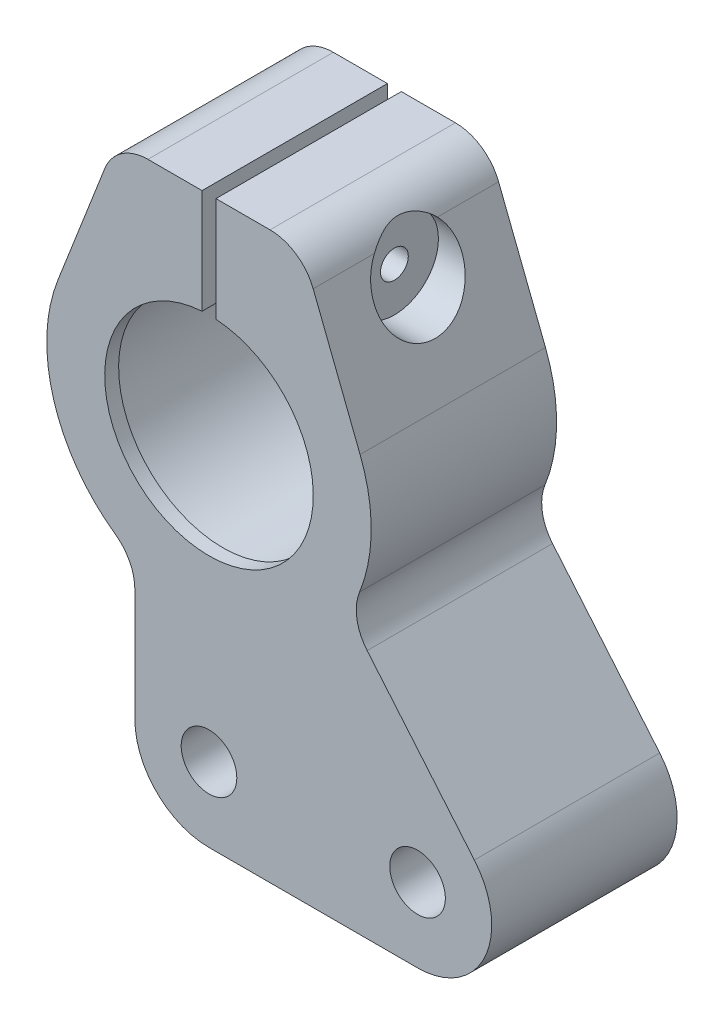
ISO-10303-21;
HEADER;
FILE_DESCRIPTION(('STEP AP214'),'2;1');
FILE_NAME('part.step','',(''),(''),'','','');
FILE_SCHEMA(('AUTOMOTIVE_DESIGN { 1 0 10303 214 1 1 1 1 }'));
ENDSEC;
DATA;
#1=APPLICATION_CONTEXT('core data for automotive mechanical design processes');
#2=APPLICATION_PROTOCOL_DEFINITION('international standard','automotive_design',2000,#1);
#3=PRODUCT_CONTEXT('',#1,'mechanical');
#4=PRODUCT('Part','Part','',(#3));
#5=PRODUCT_RELATED_PRODUCT_CATEGORY('part','',(#4));
#6=PRODUCT_DEFINITION_FORMATION('','',#4);
#7=PRODUCT_DEFINITION_CONTEXT('part definition',#1,'design');
#8=PRODUCT_DEFINITION('design','',#6,#7);
#9=PRODUCT_DEFINITION_SHAPE('','',#8);
#10=(LENGTH_UNIT() NAMED_UNIT(*) SI_UNIT(.MILLI.,.METRE.));
#11=(NAMED_UNIT(*) PLANE_ANGLE_UNIT() SI_UNIT($,.RADIAN.));
#12=(NAMED_UNIT(*) SI_UNIT($,.STERADIAN.) SOLID_ANGLE_UNIT());
#13=UNCERTAINTY_MEASURE_WITH_UNIT(LENGTH_MEASURE(1.E-05),#10,'distance_accuracy_value','');
#14=(GEOMETRIC_REPRESENTATION_CONTEXT(3) GLOBAL_UNCERTAINTY_ASSIGNED_CONTEXT((#13)) GLOBAL_UNIT_ASSIGNED_CONTEXT((#10,
#11,#12)) REPRESENTATION_CONTEXT('',''));
#15=CARTESIAN_POINT('',(0.,0.,0.));
#16=DIRECTION('',(0.,0.,1.));
#17=DIRECTION('',(1.,0.,0.));
#18=AXIS2_PLACEMENT_3D('',#15,#16,#17);
#19=CARTESIAN_POINT('',(0.,0.,40.));
#20=DIRECTION('',(0.,0.,-1.));
#21=DIRECTION('',(-1.,0.,0.));
#22=AXIS2_PLACEMENT_3D('',#19,#20,#21);
#23=CYLINDRICAL_SURFACE('',#22,25.25);
#24=DIRECTION('',(0.,0.,-1.));
#25=VECTOR('',#24,1.);
#26=CARTESIAN_POINT('',(-1.5,25.2054061661383,40.));
#27=LINE('',#26,#25);
#28=CARTESIAN_POINT('',(-1.5,25.2054061661383,37.));
#29=VERTEX_POINT('',#28);
#30=CARTESIAN_POINT('',(-1.5,25.2054061661383,0.));
#31=VERTEX_POINT('',#30);
#32=EDGE_CURVE('E60',#29,#31,#27,.T.);
#33=ORIENTED_EDGE('',*,*,#32,.F.);
#34=CARTESIAN_POINT('',(0.,0.,37.));
#35=DIRECTION('',(0.,0.,1.));
#36=DIRECTION('',(1.,0.,0.));
#37=AXIS2_PLACEMENT_3D('',#34,#35,#36);
#38=CIRCLE('',#37,25.25);
#39=CARTESIAN_POINT('',(1.5,25.2054061661382,37.));
#40=VERTEX_POINT('',#39);
#41=EDGE_CURVE('E55',#40,#29,#38,.F.);
#42=ORIENTED_EDGE('',*,*,#41,.F.);
#43=DIRECTION('',(0.,0.,-1.));
#44=VECTOR('',#43,1.);
#45=CARTESIAN_POINT('',(1.5,25.2054061661382,40.));
#46=LINE('',#45,#44);
#47=CARTESIAN_POINT('',(1.5,25.2054061661382,0.));
#48=VERTEX_POINT('',#47);
#49=EDGE_CURVE('E322',#40,#48,#46,.T.);
#50=ORIENTED_EDGE('',*,*,#49,.T.);
#51=CARTESIAN_POINT('',(0.,0.,0.));
#52=DIRECTION('',(0.,0.,1.));
#53=DIRECTION('',(1.,0.,0.));
#54=AXIS2_PLACEMENT_3D('',#51,#52,#53);
#55=CIRCLE('',#54,25.25);
#56=EDGE_CURVE('E306',#31,#48,#55,.T.);
#57=ORIENTED_EDGE('',*,*,#56,.F.);
#58=EDGE_LOOP('',(#33,#42,#50,#57));
#59=FACE_BOUND('',#58,.T.);
#60=ADVANCED_FACE('F35',(#59),#23,.F.);
#61=CARTESIAN_POINT('',(1.5,0.,40.));
#62=DIRECTION('',(1.,0.,0.));
#63=DIRECTION('',(0.,1.,0.));
#64=AXIS2_PLACEMENT_3D('',#61,#62,#63);
#65=PLANE('',#64);
#66=DIRECTION('',(0.,-1.,0.));
#67=VECTOR('',#66,1.);
#68=CARTESIAN_POINT('',(1.5,0.,0.));
#69=LINE('',#68,#67);
#70=CARTESIAN_POINT('',(1.5,45.,0.));
#71=VERTEX_POINT('',#70);
#72=EDGE_CURVE('E303',#71,#48,#69,.T.);
#73=ORIENTED_EDGE('',*,*,#72,.T.);
#74=ORIENTED_EDGE('',*,*,#49,.F.);
#75=DIRECTION('',(0.,1.,0.));
#76=VECTOR('',#75,1.);
#77=CARTESIAN_POINT('',(1.5,0.,37.));
#78=LINE('',#77,#76);
#79=CARTESIAN_POINT('',(1.5,22.4499443206436,37.));
#80=VERTEX_POINT('',#79);
#81=EDGE_CURVE('E200',#80,#40,#78,.T.);
#82=ORIENTED_EDGE('',*,*,#81,.F.);
#83=DIRECTION('',(0.,0.,1.));
#84=VECTOR('',#83,1.);
#85=CARTESIAN_POINT('',(1.5,22.4499443206436,37.));
#86=LINE('',#85,#84);
#87=CARTESIAN_POINT('',(1.5,22.4499443206436,40.));
#88=VERTEX_POINT('',#87);
#89=EDGE_CURVE('E199',#80,#88,#86,.T.);
#90=ORIENTED_EDGE('',*,*,#89,.T.);
#91=DIRECTION('',(0.,-1.,0.));
#92=VECTOR('',#91,1.);
#93=CARTESIAN_POINT('',(1.5,0.,40.));
#94=LINE('',#93,#92);
#95=CARTESIAN_POINT('',(1.5,45.,40.));
#96=VERTEX_POINT('',#95);
#97=EDGE_CURVE('E267',#96,#88,#94,.T.);
#98=ORIENTED_EDGE('',*,*,#97,.F.);
#99=DIRECTION('',(0.,0.,-1.));
#100=VECTOR('',#99,1.);
#101=CARTESIAN_POINT('',(1.5,45.,40.));
#102=LINE('',#101,#100);
#103=EDGE_CURVE('E324',#96,#71,#102,.T.);
#104=ORIENTED_EDGE('',*,*,#103,.T.);
#105=EDGE_LOOP('',(#73,#74,#82,#90,#98,#104));
#106=FACE_BOUND('',#105,.T.);
#107=CARTESIAN_POINT('',(1.5,32.,20.));
#108=DIRECTION('',(1.,0.,0.));
#109=DIRECTION('',(0.,1.,0.));
#110=AXIS2_PLACEMENT_3D('',#107,#108,#109);
#111=CIRCLE('',#110,3.);
#112=CARTESIAN_POINT('',(1.5,35.,20.));
#113=VERTEX_POINT('',#112);
#114=EDGE_CURVE('E221',#113,#113,#111,.F.);
#115=ORIENTED_EDGE('',*,*,#114,.F.);
#116=EDGE_LOOP('',(#115));
#117=FACE_BOUND('',#116,.T.);
#118=ADVANCED_FACE('F422',(#106,#117),#65,.F.);
#119=CARTESIAN_POINT('',(20.,32.,20.));
#120=DIRECTION('',(-1.,0.,0.));
#121=DIRECTION('',(0.,0.,-1.));
#122=AXIS2_PLACEMENT_3D('',#119,#120,#121);
#123=PLANE('',#122);
#124=CARTESIAN_POINT('',(20.,32.,20.));
#125=DIRECTION('',(1.,0.,0.));
#126=DIRECTION('',(0.,0.,-1.));
#127=AXIS2_PLACEMENT_3D('',#124,#125,#126);
#128=CIRCLE('',#127,9.5);
#129=CARTESIAN_POINT('',(20.,32.,10.5));
#130=VERTEX_POINT('',#129);
#131=EDGE_CURVE('E224',#130,#130,#128,.T.);
#132=ORIENTED_EDGE('',*,*,#131,.T.);
#133=EDGE_LOOP('',(#132));
#134=FACE_BOUND('',#133,.T.);
#135=CARTESIAN_POINT('',(20.,32.,20.));
#136=DIRECTION('',(-1.,0.,0.));
#137=DIRECTION('',(0.,0.,1.));
#138=AXIS2_PLACEMENT_3D('',#135,#136,#137);
#139=CIRCLE('',#138,3.);
#140=CARTESIAN_POINT('',(20.,32.,23.));
#141=VERTEX_POINT('',#140);
#142=EDGE_CURVE('E217',#141,#141,#139,.T.);
#143=ORIENTED_EDGE('',*,*,#142,.T.);
#144=EDGE_LOOP('',(#143));
#145=FACE_BOUND('',#144,.T.);
#146=ADVANCED_FACE('F425',(#134,#145),#123,.F.);
#147=CARTESIAN_POINT('',(32.6018970880081,12.7324901831075,40.));
#148=DIRECTION('',(-0.931482773943089,-0.363785433803071,0.));
#149=DIRECTION('',(0.363785433803071,-0.931482773943089,0.));
#150=AXIS2_PLACEMENT_3D('',#147,#148,#149);
#151=PLANE('',#150);
#152=CARTESIAN_POINT('',(25.077077936096,32.,20.));
#153=DIRECTION('',(-0.931482773943089,-0.363785433803071,0.));
#154=DIRECTION('',(-0.363785433803071,0.931482773943089,0.));
#155=AXIS2_PLACEMENT_3D('',#152,#153,#154);
#156=ELLIPSE('',#155,10.1987930058924,9.5);
#157=CARTESIAN_POINT('',(22.4847007205087,38.6378543380307,26.7962408570538));
#158=VERTEX_POINT('',#157);
#159=CARTESIAN_POINT('',(22.4847007205087,38.6378543380307,13.2037591429462));
#160=VERTEX_POINT('',#159);
#161=EDGE_CURVE('E227',#158,#160,#156,.F.);
#162=ORIENTED_EDGE('',*,*,#161,.F.);
#163=DIRECTION('',(0.,0.,-1.));
#164=VECTOR('',#163,1.);
#165=CARTESIAN_POINT('',(22.4847007205087,38.6378543380307,40.));
#166=LINE('',#165,#164);
#167=CARTESIAN_POINT('',(22.4847007205087,38.6378543380307,40.));
#168=VERTEX_POINT('',#167);
#169=EDGE_CURVE('E369',#158,#168,#166,.F.);
#170=ORIENTED_EDGE('',*,*,#169,.T.);
#171=DIRECTION('',(-0.363785433803071,0.931482773943089,0.));
#172=VECTOR('',#171,1.);
#173=CARTESIAN_POINT('',(32.6018970880081,12.7324901831075,40.));
#174=LINE('',#173,#172);
#175=CARTESIAN_POINT('',(32.6018970880081,12.7324901831075,40.));
#176=VERTEX_POINT('',#175);
#177=EDGE_CURVE('E261',#176,#168,#174,.T.);
#178=ORIENTED_EDGE('',*,*,#177,.F.);
#179=DIRECTION('',(0.,0.,-1.));
#180=VECTOR('',#179,1.);
#181=CARTESIAN_POINT('',(32.6018970880081,12.7324901831075,40.));
#182=LINE('',#181,#180);
#183=CARTESIAN_POINT('',(32.6018970880081,12.7324901831075,0.));
#184=VERTEX_POINT('',#183);
#185=EDGE_CURVE('E326',#176,#184,#182,.T.);
#186=ORIENTED_EDGE('',*,*,#185,.T.);
#187=DIRECTION('',(-0.363785433803071,0.931482773943089,0.));
#188=VECTOR('',#187,1.);
#189=CARTESIAN_POINT('',(32.6018970880081,12.7324901831075,0.));
#190=LINE('',#189,#188);
#191=CARTESIAN_POINT('',(22.4847007205087,38.6378543380307,0.));
#192=VERTEX_POINT('',#191);
#193=EDGE_CURVE('E297',#184,#192,#190,.T.);
#194=ORIENTED_EDGE('',*,*,#193,.T.);
#195=EDGE_CURVE('E370',#192,#160,#166,.F.);
#196=ORIENTED_EDGE('',*,*,#195,.T.);
#197=EDGE_LOOP('',(#162,#170,#178,#186,#194,#196));
#198=FACE_BOUND('',#197,.T.);
#199=ADVANCED_FACE('F431',(#198),#151,.F.);
#200=CARTESIAN_POINT('',(13.1698729810778,35.,40.));
#201=DIRECTION('',(0.,0.,1.));
#202=DIRECTION('',(1.,0.,0.));
#203=AXIS2_PLACEMENT_3D('',#200,#201,#202);
#204=CYLINDRICAL_SURFACE('',#203,10.);
#205=ORIENTED_EDGE('',*,*,#169,.F.);
#206=CARTESIAN_POINT('',(22.4847007205087,38.6378543380307,26.7962408570538));
#207=CARTESIAN_POINT('',(22.4089220284125,38.8319306718288,26.6066509987079));
#208=CARTESIAN_POINT('',(22.3295789757787,39.0171522592439,26.4095359377923));
#209=CARTESIAN_POINT('',(22.1668666860414,39.3693998350474,26.0012303084149));
#210=CARTESIAN_POINT('',(22.0834977777172,39.5364273056786,25.7900408888292));
#211=CARTESIAN_POINT('',(21.9147039907828,39.8539371562067,25.3516238882671));
#212=CARTESIAN_POINT('',(21.8292665226318,40.0041689594917,25.1242198704116));
#213=CARTESIAN_POINT('',(21.6608318800082,40.2849228958467,24.6566536351938));
#214=CARTESIAN_POINT('',(21.5778348787709,40.4154436324424,24.4164905155125));
#215=CARTESIAN_POINT('',(21.4177143447255,40.6563321018755,23.9234419670444));
#216=CARTESIAN_POINT('',(21.3406078796511,40.7666424775017,23.6705228501503));
#217=CARTESIAN_POINT('',(21.1964847722734,40.9656190359119,23.1534717000046));
#218=CARTESIAN_POINT('',(21.1294680873076,41.054285310214,22.88933971417));
#219=CARTESIAN_POINT('',(21.0100142275261,41.2081912444187,22.3529835892029));
#220=CARTESIAN_POINT('',(20.9574861216399,41.2735777994492,22.0808223659592));
#221=CARTESIAN_POINT('',(20.870260200746,41.380348263289,21.5290311638206));
#222=CARTESIAN_POINT('',(20.8355559936271,41.421740777668,21.2494039003407));
#223=CARTESIAN_POINT('',(20.7903472154125,41.4752911814527,20.7264096887685));
#224=CARTESIAN_POINT('',(20.7770767409778,41.4908014950537,20.4836220452338));
#225=CARTESIAN_POINT('',(20.7665566099697,41.5031127859657,19.9972316633137));
#226=CARTESIAN_POINT('',(20.7693053589349,41.4999156253111,19.753629008462));
#227=CARTESIAN_POINT('',(20.7906557371945,41.4748695854423,19.2678382810917));
#228=CARTESIAN_POINT('',(20.8092739494492,41.4530011954931,19.0256519552239));
#229=CARTESIAN_POINT('',(20.8611421876952,41.3910850721146,18.5452715242599));
#230=CARTESIAN_POINT('',(20.8943925360294,41.3510369381886,18.3070775072335));
#231=CARTESIAN_POINT('',(21.0013015682798,41.219345519334,17.6718561082701));
#232=CARTESIAN_POINT('',(21.0869598180243,41.1112045705784,17.2801776470196));
#233=CARTESIAN_POINT('',(21.2829365452269,40.8484892993799,16.5190645449007));
#234=CARTESIAN_POINT('',(21.3932876330211,40.6938534802985,16.1496601466098));
#235=CARTESIAN_POINT('',(21.5886805855716,40.3985332951614,15.551734099901));
#236=CARTESIAN_POINT('',(21.6703813512374,40.2694815157653,15.3162536327478));
#237=CARTESIAN_POINT('',(21.8360704738759,39.9923024347319,14.8575373957987));
#238=CARTESIAN_POINT('',(21.9200593555876,39.8441707279143,14.634304470745));
#239=CARTESIAN_POINT('',(22.0867430174897,39.530002211873,14.2016995056078));
#240=CARTESIAN_POINT('',(22.1694414680154,39.3640345883323,13.9922786530497));
#241=CARTESIAN_POINT('',(22.3308285234003,39.0142329506797,13.5873581225494));
#242=CARTESIAN_POINT('',(22.4095178646233,38.8304022356942,13.391855885497));
#243=CARTESIAN_POINT('',(22.4847007205087,38.6378543380307,13.2037591429462));
#244=B_SPLINE_CURVE_WITH_KNOTS('',3,(#206,#207,#208,#209,#210,#211,#212,#213,#214,#215,#216,
#217,#218,#219,#220,#221,#222,#223,#224,#225,#226,#227,#228,#229,#230,#231,#232,#233,#234,#235,
#236,#237,#238,#239,#240,#241,#242,#243),.UNSPECIFIED.,.F.,.F.,(4,2,2,2,2,2,2,2,2,2,2,2,2,2,2,2,
2,2,4),(0.,0.844717294944796,1.68936572070047,2.54528745223134,3.40126979501468,
4.25964501565844,5.1180166067589,5.97087164563447,6.82342061468885,7.55315558016657,
8.2828179132575,9.01324365063628,9.74368547994665,10.9846709485961,12.2273050869061,
13.0684830211303,13.9098555161052,14.748074702782,15.5861393723115),.UNSPECIFIED.);
#245=EDGE_CURVE('E11',#158,#160,#244,.T.);
#246=ORIENTED_EDGE('',*,*,#245,.T.);
#247=ORIENTED_EDGE('',*,*,#195,.F.);
#248=CARTESIAN_POINT('',(13.1698729810778,35.,0.));
#249=DIRECTION('',(0.,0.,1.));
#250=DIRECTION('',(1.,0.,0.));
#251=AXIS2_PLACEMENT_3D('',#248,#249,#250);
#252=CIRCLE('',#251,10.);
#253=CARTESIAN_POINT('',(13.1698729810778,45.,0.));
#254=VERTEX_POINT('',#253);
#255=EDGE_CURVE('E356',#254,#192,#252,.F.);
#256=ORIENTED_EDGE('',*,*,#255,.F.);
#257=DIRECTION('',(0.,0.,-1.));
#258=VECTOR('',#257,1.);
#259=CARTESIAN_POINT('',(13.1698729810778,45.,0.));
#260=LINE('',#259,#258);
#261=CARTESIAN_POINT('',(13.1698729810778,45.,40.));
#262=VERTEX_POINT('',#261);
#263=EDGE_CURVE('E366',#262,#254,#260,.T.);
#264=ORIENTED_EDGE('',*,*,#263,.F.);
#265=CARTESIAN_POINT('',(13.1698729810778,35.,40.));
#266=DIRECTION('',(0.,0.,1.));
#267=DIRECTION('',(1.,0.,0.));
#268=AXIS2_PLACEMENT_3D('',#265,#266,#267);
#269=CIRCLE('',#268,10.);
#270=EDGE_CURVE('E362',#168,#262,#269,.T.);
#271=ORIENTED_EDGE('',*,*,#270,.F.);
#272=EDGE_LOOP('',(#205,#246,#247,#256,#264,#271));
#273=FACE_BOUND('',#272,.T.);
#274=ADVANCED_FACE('F37',(#273),#204,.T.);
#275=CARTESIAN_POINT('',(-32.6018970880081,12.7324901831075,40.));
#276=DIRECTION('',(-0.931482773943089,0.363785433803071,0.));
#277=DIRECTION('',(-0.363785433803071,-0.931482773943089,0.));
#278=AXIS2_PLACEMENT_3D('',#275,#276,#277);
#279=PLANE('',#278);
#280=CARTESIAN_POINT('',(-25.077077936096,32.,20.));
#281=DIRECTION('',(-0.931482773943089,0.363785433803071,0.));
#282=DIRECTION('',(0.363785433803071,0.931482773943089,0.));
#283=AXIS2_PLACEMENT_3D('',#280,#281,#282);
#284=ELLIPSE('',#283,10.1987930058924,9.5);
#285=CARTESIAN_POINT('',(-22.4847007205087,38.6378543380307,13.2037591429462));
#286=VERTEX_POINT('',#285);
#287=CARTESIAN_POINT('',(-22.4847007205087,38.6378543380307,26.7962408570538));
#288=VERTEX_POINT('',#287);
#289=EDGE_CURVE('E238',#286,#288,#284,.T.);
#290=ORIENTED_EDGE('',*,*,#289,.F.);
#291=DIRECTION('',(0.,0.,-1.));
#292=VECTOR('',#291,1.);
#293=CARTESIAN_POINT('',(-22.4847007205087,38.6378543380307,40.));
#294=LINE('',#293,#292);
#295=CARTESIAN_POINT('',(-22.4847007205087,38.6378543380307,0.));
#296=VERTEX_POINT('',#295);
#297=EDGE_CURVE('E352',#286,#296,#294,.T.);
#298=ORIENTED_EDGE('',*,*,#297,.T.);
#299=DIRECTION('',(0.363785433803071,0.931482773943089,0.));
#300=VECTOR('',#299,1.);
#301=CARTESIAN_POINT('',(-32.6018970880081,12.7324901831075,0.));
#302=LINE('',#301,#300);
#303=CARTESIAN_POINT('',(-32.6018970880081,12.7324901831075,0.));
#304=VERTEX_POINT('',#303);
#305=EDGE_CURVE('E240',#304,#296,#302,.T.);
#306=ORIENTED_EDGE('',*,*,#305,.F.);
#307=DIRECTION('',(0.,0.,-1.));
#308=VECTOR('',#307,1.);
#309=CARTESIAN_POINT('',(-32.6018970880081,12.7324901831075,40.));
#310=LINE('',#309,#308);
#311=CARTESIAN_POINT('',(-32.6018970880081,12.7324901831075,40.));
#312=VERTEX_POINT('',#311);
#313=EDGE_CURVE('E340',#312,#304,#310,.T.);
#314=ORIENTED_EDGE('',*,*,#313,.F.);
#315=DIRECTION('',(0.363785433803071,0.931482773943089,0.));
#316=VECTOR('',#315,1.);
#317=CARTESIAN_POINT('',(-32.6018970880081,12.7324901831075,40.));
#318=LINE('',#317,#316);
#319=CARTESIAN_POINT('',(-22.4847007205087,38.6378543380307,40.));
#320=VERTEX_POINT('',#319);
#321=EDGE_CURVE('E241',#312,#320,#318,.T.);
#322=ORIENTED_EDGE('',*,*,#321,.T.);
#323=EDGE_CURVE('E353',#320,#288,#294,.T.);
#324=ORIENTED_EDGE('',*,*,#323,.T.);
#325=EDGE_LOOP('',(#290,#298,#306,#314,#322,#324));
#326=FACE_BOUND('',#325,.T.);
#327=ADVANCED_FACE('F459',(#326),#279,.T.);
#328=CARTESIAN_POINT('',(0.,0.,40.));
#329=DIRECTION('',(0.,0.,-1.));
#330=DIRECTION('',(-1.,0.,0.));
#331=AXIS2_PLACEMENT_3D('',#328,#329,#330);
#332=CYLINDRICAL_SURFACE('',#331,35.);
#333=CARTESIAN_POINT('',(0.,0.,0.));
#334=DIRECTION('',(0.,0.,1.));
#335=DIRECTION('',(1.,0.,0.));
#336=AXIS2_PLACEMENT_3D('',#333,#334,#335);
#337=CIRCLE('',#336,35.);
#338=CARTESIAN_POINT('',(-20.2222222222222,-28.5667941567664,0.));
#339=VERTEX_POINT('',#338);
#340=EDGE_CURVE('E281',#304,#339,#337,.T.);
#341=ORIENTED_EDGE('',*,*,#340,.T.);
#342=DIRECTION('',(0.,0.,-1.));
#343=VECTOR('',#342,1.);
#344=CARTESIAN_POINT('',(-20.2222222222222,-28.5667941567664,40.));
#345=LINE('',#344,#343);
#346=CARTESIAN_POINT('',(-20.2222222222222,-28.5667941567664,40.));
#347=VERTEX_POINT('',#346);
#348=EDGE_CURVE('E345',#339,#347,#345,.F.);
#349=ORIENTED_EDGE('',*,*,#348,.T.);
#350=CARTESIAN_POINT('',(0.,0.,40.));
#351=DIRECTION('',(0.,0.,1.));
#352=DIRECTION('',(1.,0.,0.));
#353=AXIS2_PLACEMENT_3D('',#350,#351,#352);
#354=CIRCLE('',#353,35.);
#355=EDGE_CURVE('E244',#312,#347,#354,.T.);
#356=ORIENTED_EDGE('',*,*,#355,.F.);
#357=ORIENTED_EDGE('',*,*,#313,.T.);
#358=EDGE_LOOP('',(#341,#349,#356,#357));
#359=FACE_BOUND('',#358,.T.);
#360=ADVANCED_FACE('F439',(#359),#332,.T.);
#361=CARTESIAN_POINT('',(-16.,0.,40.));
#362=DIRECTION('',(-1.,0.,0.));
#363=DIRECTION('',(0.,0.,1.));
#364=AXIS2_PLACEMENT_3D('',#361,#362,#363);
#365=PLANE('',#364);
#366=DIRECTION('',(0.,1.,0.));
#367=VECTOR('',#366,1.);
#368=CARTESIAN_POINT('',(-16.,0.,40.));
#369=LINE('',#368,#367);
#370=CARTESIAN_POINT('',(-16.,-61.,40.));
#371=VERTEX_POINT('',#370);
#372=CARTESIAN_POINT('',(-16.,-36.7287353444139,40.));
#373=VERTEX_POINT('',#372);
#374=EDGE_CURVE('E248',#371,#373,#369,.T.);
#375=ORIENTED_EDGE('',*,*,#374,.T.);
#376=DIRECTION('',(0.,0.,-1.));
#377=VECTOR('',#376,1.);
#378=CARTESIAN_POINT('',(-16.,-36.7287353444139,40.));
#379=LINE('',#378,#377);
#380=CARTESIAN_POINT('',(-16.,-36.7287353444139,0.));
#381=VERTEX_POINT('',#380);
#382=EDGE_CURVE('E342',#373,#381,#379,.T.);
#383=ORIENTED_EDGE('',*,*,#382,.T.);
#384=DIRECTION('',(0.,1.,0.));
#385=VECTOR('',#384,1.);
#386=CARTESIAN_POINT('',(-16.,0.,0.));
#387=LINE('',#386,#385);
#388=CARTESIAN_POINT('',(-16.,-61.,0.));
#389=VERTEX_POINT('',#388);
#390=EDGE_CURVE('E284',#389,#381,#387,.T.);
#391=ORIENTED_EDGE('',*,*,#390,.F.);
#392=DIRECTION('',(0.,0.,-1.));
#393=VECTOR('',#392,1.);
#394=CARTESIAN_POINT('',(-16.,-61.,40.));
#395=LINE('',#394,#393);
#396=EDGE_CURVE('E338',#371,#389,#395,.T.);
#397=ORIENTED_EDGE('',*,*,#396,.F.);
#398=EDGE_LOOP('',(#375,#383,#391,#397));
#399=FACE_BOUND('',#398,.T.);
#400=ADVANCED_FACE('F454',(#399),#365,.T.);
#401=CARTESIAN_POINT('',(0.,-61.,40.));
#402=DIRECTION('',(0.,0.,-1.));
#403=DIRECTION('',(-1.,0.,0.));
#404=AXIS2_PLACEMENT_3D('',#401,#402,#403);
#405=CYLINDRICAL_SURFACE('',#404,16.);
#406=CARTESIAN_POINT('',(0.,-61.,0.));
#407=DIRECTION('',(0.,0.,1.));
#408=DIRECTION('',(1.,0.,0.));
#409=AXIS2_PLACEMENT_3D('',#406,#407,#408);
#410=CIRCLE('',#409,16.);
#411=CARTESIAN_POINT('',(0.,-77.,0.));
#412=VERTEX_POINT('',#411);
#413=EDGE_CURVE('E288',#389,#412,#410,.T.);
#414=ORIENTED_EDGE('',*,*,#413,.T.);
#415=DIRECTION('',(0.,0.,-1.));
#416=VECTOR('',#415,1.);
#417=CARTESIAN_POINT('',(0.,-77.,40.));
#418=LINE('',#417,#416);
#419=CARTESIAN_POINT('',(0.,-77.,40.));
#420=VERTEX_POINT('',#419);
#421=EDGE_CURVE('E335',#420,#412,#418,.T.);
#422=ORIENTED_EDGE('',*,*,#421,.F.);
#423=CARTESIAN_POINT('',(0.,-61.,40.));
#424=DIRECTION('',(0.,0.,1.));
#425=DIRECTION('',(1.,0.,0.));
#426=AXIS2_PLACEMENT_3D('',#423,#424,#425);
#427=CIRCLE('',#426,16.);
#428=EDGE_CURVE('E252',#371,#420,#427,.T.);
#429=ORIENTED_EDGE('',*,*,#428,.F.);
#430=ORIENTED_EDGE('',*,*,#396,.T.);
#431=EDGE_LOOP('',(#414,#422,#429,#430));
#432=FACE_BOUND('',#431,.T.);
#433=ADVANCED_FACE('F450',(#432),#405,.T.);
#434=CARTESIAN_POINT('',(0.,-77.,40.));
#435=DIRECTION('',(0.,1.,0.));
#436=DIRECTION('',(-1.,0.,0.));
#437=AXIS2_PLACEMENT_3D('',#434,#435,#436);
#438=PLANE('',#437);
#439=DIRECTION('',(1.,0.,0.));
#440=VECTOR('',#439,1.);
#441=CARTESIAN_POINT('',(0.,-77.,0.));
#442=LINE('',#441,#440);
#443=CARTESIAN_POINT('',(45.,-77.,0.));
#444=VERTEX_POINT('',#443);
#445=EDGE_CURVE('E290',#412,#444,#442,.T.);
#446=ORIENTED_EDGE('',*,*,#445,.T.);
#447=DIRECTION('',(0.,0.,-1.));
#448=VECTOR('',#447,1.);
#449=CARTESIAN_POINT('',(45.,-77.,40.));
#450=LINE('',#449,#448);
#451=CARTESIAN_POINT('',(45.,-77.,40.));
#452=VERTEX_POINT('',#451);
#453=EDGE_CURVE('E332',#452,#444,#450,.T.);
#454=ORIENTED_EDGE('',*,*,#453,.F.);
#455=DIRECTION('',(1.,0.,0.));
#456=VECTOR('',#455,1.);
#457=CARTESIAN_POINT('',(0.,-77.,40.));
#458=LINE('',#457,#456);
#459=EDGE_CURVE('E254',#420,#452,#458,.T.);
#460=ORIENTED_EDGE('',*,*,#459,.F.);
#461=ORIENTED_EDGE('',*,*,#421,.T.);
#462=EDGE_LOOP('',(#446,#454,#460,#461));
#463=FACE_BOUND('',#462,.T.);
#464=ADVANCED_FACE('F446',(#463),#438,.F.);
#465=CARTESIAN_POINT('',(45.,-61.,40.));
#466=DIRECTION('',(0.,0.,-1.));
#467=DIRECTION('',(-1.,0.,0.));
#468=AXIS2_PLACEMENT_3D('',#465,#466,#467);
#469=CYLINDRICAL_SURFACE('',#468,16.);
#470=CARTESIAN_POINT('',(45.,-61.,0.));
#471=DIRECTION('',(0.,0.,1.));
#472=DIRECTION('',(1.,0.,0.));
#473=AXIS2_PLACEMENT_3D('',#470,#471,#472);
#474=CIRCLE('',#473,16.);
#475=CARTESIAN_POINT('',(57.2567110899036,-50.7153982450153,0.));
#476=VERTEX_POINT('',#475);
#477=EDGE_CURVE('E292',#444,#476,#474,.T.);
#478=ORIENTED_EDGE('',*,*,#477,.T.);
#479=DIRECTION('',(0.,0.,-1.));
#480=VECTOR('',#479,1.);
#481=CARTESIAN_POINT('',(57.2567110899036,-50.7153982450153,40.));
#482=LINE('',#481,#480);
#483=CARTESIAN_POINT('',(57.2567110899036,-50.7153982450153,40.));
#484=VERTEX_POINT('',#483);
#485=EDGE_CURVE('E329',#484,#476,#482,.T.);
#486=ORIENTED_EDGE('',*,*,#485,.F.);
#487=CARTESIAN_POINT('',(45.,-61.,40.));
#488=DIRECTION('',(0.,0.,1.));
#489=DIRECTION('',(1.,0.,0.));
#490=AXIS2_PLACEMENT_3D('',#487,#488,#489);
#491=CIRCLE('',#490,16.);
#492=EDGE_CURVE('E256',#452,#484,#491,.T.);
#493=ORIENTED_EDGE('',*,*,#492,.F.);
#494=ORIENTED_EDGE('',*,*,#453,.T.);
#495=EDGE_LOOP('',(#478,#486,#493,#494));
#496=FACE_BOUND('',#495,.T.);
#497=ADVANCED_FACE('F442',(#496),#469,.T.);
#498=CARTESIAN_POINT('',(8.62715862053689,7.23904561660047,40.));
#499=DIRECTION('',(-0.766044443118975,-0.642787609686544,0.));
#500=DIRECTION('',(0.642787609686544,-0.766044443118975,0.));
#501=AXIS2_PLACEMENT_3D('',#498,#499,#500);
#502=PLANE('',#501);
#503=DIRECTION('',(-0.642787609686544,0.766044443118975,0.));
#504=VECTOR('',#503,1.);
#505=CARTESIAN_POINT('',(8.62715862053689,7.23904561660047,0.));
#506=LINE('',#505,#504);
#507=CARTESIAN_POINT('',(34.1202257367204,-23.1424087053562,0.));
#508=VERTEX_POINT('',#507);
#509=EDGE_CURVE('E294',#476,#508,#506,.T.);
#510=ORIENTED_EDGE('',*,*,#509,.T.);
#511=DIRECTION('',(0.,0.,1.));
#512=VECTOR('',#511,1.);
#513=CARTESIAN_POINT('',(34.1202257367204,-23.1424087053562,40.));
#514=LINE('',#513,#512);
#515=CARTESIAN_POINT('',(34.1202257367204,-23.1424087053562,40.));
#516=VERTEX_POINT('',#515);
#517=EDGE_CURVE('E350',#508,#516,#514,.T.);
#518=ORIENTED_EDGE('',*,*,#517,.T.);
#519=DIRECTION('',(-0.642787609686544,0.766044443118975,0.));
#520=VECTOR('',#519,1.);
#521=CARTESIAN_POINT('',(8.62715862053689,7.23904561660047,40.));
#522=LINE('',#521,#520);
#523=EDGE_CURVE('E258',#484,#516,#522,.T.);
#524=ORIENTED_EDGE('',*,*,#523,.F.);
#525=ORIENTED_EDGE('',*,*,#485,.T.);
#526=EDGE_LOOP('',(#510,#518,#524,#525));
#527=FACE_BOUND('',#526,.T.);
#528=ADVANCED_FACE('F437',(#527),#502,.F.);
#529=CARTESIAN_POINT('',(32.4960767972635,-13.0001920288262,40.));
#530=VERTEX_POINT('',#529);
#531=EDGE_CURVE('E249',#530,#176,#354,.T.);
#532=ORIENTED_EDGE('',*,*,#531,.F.);
#533=DIRECTION('',(0.,0.,-1.));
#534=VECTOR('',#533,1.);
#535=CARTESIAN_POINT('',(32.4960767972635,-13.0001920288262,40.));
#536=LINE('',#535,#534);
#537=CARTESIAN_POINT('',(32.4960767972635,-13.0001920288262,0.));
#538=VERTEX_POINT('',#537);
#539=EDGE_CURVE('E347',#530,#538,#536,.T.);
#540=ORIENTED_EDGE('',*,*,#539,.T.);
#541=EDGE_CURVE('E285',#538,#184,#337,.T.);
#542=ORIENTED_EDGE('',*,*,#541,.T.);
#543=ORIENTED_EDGE('',*,*,#185,.F.);
#544=EDGE_LOOP('',(#532,#540,#542,#543));
#545=FACE_BOUND('',#544,.T.);
#546=ADVANCED_FACE('F429',(#545),#332,.T.);
#547=CARTESIAN_POINT('',(0.,45.,40.));
#548=DIRECTION('',(0.,1.,0.));
#549=DIRECTION('',(0.,0.,1.));
#550=AXIS2_PLACEMENT_3D('',#547,#548,#549);
#551=PLANE('',#550);
#552=DIRECTION('',(1.,0.,0.));
#553=VECTOR('',#552,1.);
#554=CARTESIAN_POINT('',(0.,45.,40.));
#555=LINE('',#554,#553);
#556=EDGE_CURVE('E264',#96,#262,#555,.T.);
#557=ORIENTED_EDGE('',*,*,#556,.T.);
#558=ORIENTED_EDGE('',*,*,#263,.T.);
#559=DIRECTION('',(1.,0.,0.));
#560=VECTOR('',#559,1.);
#561=CARTESIAN_POINT('',(0.,45.,0.));
#562=LINE('',#561,#560);
#563=EDGE_CURVE('E300',#71,#254,#562,.T.);
#564=ORIENTED_EDGE('',*,*,#563,.F.);
#565=ORIENTED_EDGE('',*,*,#103,.F.);
#566=EDGE_LOOP('',(#557,#558,#564,#565));
#567=FACE_BOUND('',#566,.T.);
#568=ADVANCED_FACE('F418',(#567),#551,.T.);
#569=CARTESIAN_POINT('',(-1.5,0.,40.));
#570=DIRECTION('',(1.,0.,0.));
#571=DIRECTION('',(0.,1.,0.));
#572=AXIS2_PLACEMENT_3D('',#569,#570,#571);
#573=PLANE('',#572);
#574=CARTESIAN_POINT('',(-1.5,32.,20.));
#575=DIRECTION('',(1.,0.,0.));
#576=DIRECTION('',(0.,1.,0.));
#577=AXIS2_PLACEMENT_3D('',#574,#575,#576);
#578=CIRCLE('',#577,3.);
#579=CARTESIAN_POINT('',(-1.5,35.,20.));
#580=VERTEX_POINT('',#579);
#581=EDGE_CURVE('E232',#580,#580,#578,.F.);
#582=ORIENTED_EDGE('',*,*,#581,.T.);
#583=EDGE_LOOP('',(#582));
#584=FACE_BOUND('',#583,.T.);
#585=DIRECTION('',(0.,-1.,0.));
#586=VECTOR('',#585,1.);
#587=CARTESIAN_POINT('',(-1.5,0.,0.));
#588=LINE('',#587,#586);
#589=CARTESIAN_POINT('',(-1.5,45.,0.));
#590=VERTEX_POINT('',#589);
#591=EDGE_CURVE('E309',#590,#31,#588,.T.);
#592=ORIENTED_EDGE('',*,*,#591,.F.);
#593=DIRECTION('',(0.,0.,-1.));
#594=VECTOR('',#593,1.);
#595=CARTESIAN_POINT('',(-1.5,45.,40.));
#596=LINE('',#595,#594);
#597=CARTESIAN_POINT('',(-1.5,45.,40.));
#598=VERTEX_POINT('',#597);
#599=EDGE_CURVE('E278',#598,#590,#596,.T.);
#600=ORIENTED_EDGE('',*,*,#599,.F.);
#601=DIRECTION('',(0.,-1.,0.));
#602=VECTOR('',#601,1.);
#603=CARTESIAN_POINT('',(-1.5,0.,40.));
#604=LINE('',#603,#602);
#605=CARTESIAN_POINT('',(-1.5,22.4499443206436,40.));
#606=VERTEX_POINT('',#605);
#607=EDGE_CURVE('E195',#598,#606,#604,.T.);
#608=ORIENTED_EDGE('',*,*,#607,.T.);
#609=DIRECTION('',(0.,0.,1.));
#610=VECTOR('',#609,1.);
#611=CARTESIAN_POINT('',(-1.5,22.4499443206436,37.));
#612=LINE('',#611,#610);
#613=CARTESIAN_POINT('',(-1.5,22.4499443206436,37.));
#614=VERTEX_POINT('',#613);
#615=EDGE_CURVE('E187',#614,#606,#612,.T.);
#616=ORIENTED_EDGE('',*,*,#615,.F.);
#617=DIRECTION('',(0.,1.,0.));
#618=VECTOR('',#617,1.);
#619=CARTESIAN_POINT('',(-1.5,0.,37.));
#620=LINE('',#619,#618);
#621=EDGE_CURVE('E192',#614,#29,#620,.T.);
#622=ORIENTED_EDGE('',*,*,#621,.T.);
#623=ORIENTED_EDGE('',*,*,#32,.T.);
#624=EDGE_LOOP('',(#592,#600,#608,#616,#622,#623));
#625=FACE_BOUND('',#624,.T.);
#626=ADVANCED_FACE('F190',(#584,#625),#573,.T.);
#627=CARTESIAN_POINT('',(0.,-61.,40.));
#628=DIRECTION('',(0.,0.,-1.));
#629=DIRECTION('',(-1.,0.,0.));
#630=AXIS2_PLACEMENT_3D('',#627,#628,#629);
#631=CYLINDRICAL_SURFACE('',#630,6.);
#632=CARTESIAN_POINT('',(0.,-61.,40.));
#633=DIRECTION('',(0.,0.,1.));
#634=DIRECTION('',(1.,0.,0.));
#635=AXIS2_PLACEMENT_3D('',#632,#633,#634);
#636=CIRCLE('',#635,6.);
#637=CARTESIAN_POINT('',(6.,-61.,40.));
#638=VERTEX_POINT('',#637);
#639=EDGE_CURVE('E272',#638,#638,#636,.T.);
#640=ORIENTED_EDGE('',*,*,#639,.T.);
#641=EDGE_LOOP('',(#640));
#642=FACE_BOUND('',#641,.T.);
#643=CARTESIAN_POINT('',(0.,-61.,0.));
#644=DIRECTION('',(0.,0.,1.));
#645=DIRECTION('',(1.,0.,0.));
#646=AXIS2_PLACEMENT_3D('',#643,#644,#645);
#647=CIRCLE('',#646,6.);
#648=CARTESIAN_POINT('',(6.,-61.,0.));
#649=VERTEX_POINT('',#648);
#650=EDGE_CURVE('E314',#649,#649,#647,.T.);
#651=ORIENTED_EDGE('',*,*,#650,.F.);
#652=EDGE_LOOP('',(#651));
#653=FACE_BOUND('',#652,.T.);
#654=ADVANCED_FACE('F409',(#642,#653),#631,.F.);
#655=CARTESIAN_POINT('',(0.,45.,40.));
#656=DIRECTION('',(0.,1.,0.));
#657=DIRECTION('',(0.,0.,1.));
#658=AXIS2_PLACEMENT_3D('',#655,#656,#657);
#659=PLANE('',#658);
#660=DIRECTION('',(1.,0.,0.));
#661=VECTOR('',#660,1.);
#662=CARTESIAN_POINT('',(0.,45.,0.));
#663=LINE('',#662,#661);
#664=CARTESIAN_POINT('',(-13.1698729810778,45.,0.));
#665=VERTEX_POINT('',#664);
#666=EDGE_CURVE('E312',#665,#590,#663,.T.);
#667=ORIENTED_EDGE('',*,*,#666,.F.);
#668=DIRECTION('',(0.,0.,-1.));
#669=VECTOR('',#668,1.);
#670=CARTESIAN_POINT('',(-13.1698729810778,45.,40.));
#671=LINE('',#670,#669);
#672=CARTESIAN_POINT('',(-13.1698729810778,45.,40.));
#673=VERTEX_POINT('',#672);
#674=EDGE_CURVE('E360',#665,#673,#671,.F.);
#675=ORIENTED_EDGE('',*,*,#674,.T.);
#676=DIRECTION('',(1.,0.,0.));
#677=VECTOR('',#676,1.);
#678=CARTESIAN_POINT('',(0.,45.,40.));
#679=LINE('',#678,#677);
#680=EDGE_CURVE('E270',#673,#598,#679,.T.);
#681=ORIENTED_EDGE('',*,*,#680,.T.);
#682=ORIENTED_EDGE('',*,*,#599,.T.);
#683=EDGE_LOOP('',(#667,#675,#681,#682));
#684=FACE_BOUND('',#683,.T.);
#685=ADVANCED_FACE('F407',(#684),#659,.T.);
#686=CARTESIAN_POINT('',(45.,-61.,40.));
#687=DIRECTION('',(0.,0.,-1.));
#688=DIRECTION('',(-1.,0.,0.));
#689=AXIS2_PLACEMENT_3D('',#686,#687,#688);
#690=CYLINDRICAL_SURFACE('',#689,6.);
#691=CARTESIAN_POINT('',(45.,-61.,40.));
#692=DIRECTION('',(0.,0.,1.));
#693=DIRECTION('',(1.,0.,0.));
#694=AXIS2_PLACEMENT_3D('',#691,#692,#693);
#695=CIRCLE('',#694,6.);
#696=CARTESIAN_POINT('',(51.,-61.,40.));
#697=VERTEX_POINT('',#696);
#698=EDGE_CURVE('E275',#697,#697,#695,.T.);
#699=ORIENTED_EDGE('',*,*,#698,.T.);
#700=EDGE_LOOP('',(#699));
#701=FACE_BOUND('',#700,.T.);
#702=CARTESIAN_POINT('',(45.,-61.,0.));
#703=DIRECTION('',(0.,0.,1.));
#704=DIRECTION('',(1.,0.,0.));
#705=AXIS2_PLACEMENT_3D('',#702,#703,#704);
#706=CIRCLE('',#705,6.);
#707=CARTESIAN_POINT('',(51.,-61.,0.));
#708=VERTEX_POINT('',#707);
#709=EDGE_CURVE('E245',#708,#708,#706,.T.);
#710=ORIENTED_EDGE('',*,*,#709,.F.);
#711=EDGE_LOOP('',(#710));
#712=FACE_BOUND('',#711,.T.);
#713=ADVANCED_FACE('F399',(#701,#712),#690,.F.);
#714=CARTESIAN_POINT('',(0.,0.,40.));
#715=DIRECTION('',(0.,0.,1.));
#716=DIRECTION('',(1.,0.,0.));
#717=AXIS2_PLACEMENT_3D('',#714,#715,#716);
#718=PLANE('',#717);
#719=ORIENTED_EDGE('',*,*,#680,.F.);
#720=CARTESIAN_POINT('',(-13.1698729810778,35.,40.));
#721=DIRECTION('',(0.,0.,1.));
#722=DIRECTION('',(1.,0.,0.));
#723=AXIS2_PLACEMENT_3D('',#720,#721,#722);
#724=CIRCLE('',#723,10.);
#725=EDGE_CURVE('E364',#673,#320,#724,.T.);
#726=ORIENTED_EDGE('',*,*,#725,.T.);
#727=ORIENTED_EDGE('',*,*,#321,.F.);
#728=ORIENTED_EDGE('',*,*,#355,.T.);
#729=CARTESIAN_POINT('',(-26.,-36.7287353444139,40.));
#730=DIRECTION('',(0.,0.,1.));
#731=DIRECTION('',(1.,0.,0.));
#732=AXIS2_PLACEMENT_3D('',#729,#730,#731);
#733=CIRCLE('',#732,10.);
#734=EDGE_CURVE('E375',#347,#373,#733,.F.);
#735=ORIENTED_EDGE('',*,*,#734,.T.);
#736=ORIENTED_EDGE('',*,*,#374,.F.);
#737=ORIENTED_EDGE('',*,*,#428,.T.);
#738=ORIENTED_EDGE('',*,*,#459,.T.);
#739=ORIENTED_EDGE('',*,*,#492,.T.);
#740=ORIENTED_EDGE('',*,*,#523,.T.);
#741=CARTESIAN_POINT('',(41.7806701679102,-16.7145326084908,40.));
#742=DIRECTION('',(0.,0.,1.));
#743=DIRECTION('',(1.,0.,0.));
#744=AXIS2_PLACEMENT_3D('',#741,#742,#743);
#745=CIRCLE('',#744,10.);
#746=EDGE_CURVE('E379',#516,#530,#745,.F.);
#747=ORIENTED_EDGE('',*,*,#746,.T.);
#748=ORIENTED_EDGE('',*,*,#531,.T.);
#749=ORIENTED_EDGE('',*,*,#177,.T.);
#750=ORIENTED_EDGE('',*,*,#270,.T.);
#751=ORIENTED_EDGE('',*,*,#556,.F.);
#752=ORIENTED_EDGE('',*,*,#97,.T.);
#753=CARTESIAN_POINT('',(0.,0.,40.));
#754=DIRECTION('',(0.,0.,1.));
#755=DIRECTION('',(1.,0.,0.));
#756=AXIS2_PLACEMENT_3D('',#753,#754,#755);
#757=CIRCLE('',#756,22.5);
#758=EDGE_CURVE('E209',#606,#88,#757,.T.);
#759=ORIENTED_EDGE('',*,*,#758,.F.);
#760=ORIENTED_EDGE('',*,*,#607,.F.);
#761=EDGE_LOOP('',(#719,#726,#727,#728,#735,#736,#737,#738,#739,#740,#747,#748,#749,#750,#751,
#752,#759,#760));
#762=FACE_BOUND('',#761,.T.);
#763=ORIENTED_EDGE('',*,*,#639,.F.);
#764=EDGE_LOOP('',(#763));
#765=FACE_BOUND('',#764,.T.);
#766=ORIENTED_EDGE('',*,*,#698,.F.);
#767=EDGE_LOOP('',(#766));
#768=FACE_BOUND('',#767,.T.);
#769=ADVANCED_FACE('F395',(#762,#765,#768),#718,.T.);
#770=CARTESIAN_POINT('',(0.,0.,0.));
#771=DIRECTION('',(0.,0.,1.));
#772=DIRECTION('',(1.,0.,0.));
#773=AXIS2_PLACEMENT_3D('',#770,#771,#772);
#774=PLANE('',#773);
#775=ORIENTED_EDGE('',*,*,#305,.T.);
#776=CARTESIAN_POINT('',(-13.1698729810778,35.,0.));
#777=DIRECTION('',(0.,0.,1.));
#778=DIRECTION('',(1.,0.,0.));
#779=AXIS2_PLACEMENT_3D('',#776,#777,#778);
#780=CIRCLE('',#779,10.);
#781=EDGE_CURVE('E358',#296,#665,#780,.F.);
#782=ORIENTED_EDGE('',*,*,#781,.T.);
#783=ORIENTED_EDGE('',*,*,#666,.T.);
#784=ORIENTED_EDGE('',*,*,#591,.T.);
#785=ORIENTED_EDGE('',*,*,#56,.T.);
#786=ORIENTED_EDGE('',*,*,#72,.F.);
#787=ORIENTED_EDGE('',*,*,#563,.T.);
#788=ORIENTED_EDGE('',*,*,#255,.T.);
#789=ORIENTED_EDGE('',*,*,#193,.F.);
#790=ORIENTED_EDGE('',*,*,#541,.F.);
#791=CARTESIAN_POINT('',(41.7806701679102,-16.7145326084908,0.));
#792=DIRECTION('',(0.,0.,1.));
#793=DIRECTION('',(1.,0.,0.));
#794=AXIS2_PLACEMENT_3D('',#791,#792,#793);
#795=CIRCLE('',#794,10.);
#796=EDGE_CURVE('E377',#538,#508,#795,.T.);
#797=ORIENTED_EDGE('',*,*,#796,.T.);
#798=ORIENTED_EDGE('',*,*,#509,.F.);
#799=ORIENTED_EDGE('',*,*,#477,.F.);
#800=ORIENTED_EDGE('',*,*,#445,.F.);
#801=ORIENTED_EDGE('',*,*,#413,.F.);
#802=ORIENTED_EDGE('',*,*,#390,.T.);
#803=CARTESIAN_POINT('',(-26.,-36.7287353444139,0.));
#804=DIRECTION('',(0.,0.,1.));
#805=DIRECTION('',(1.,0.,0.));
#806=AXIS2_PLACEMENT_3D('',#803,#804,#805);
#807=CIRCLE('',#806,10.);
#808=EDGE_CURVE('E373',#381,#339,#807,.T.);
#809=ORIENTED_EDGE('',*,*,#808,.T.);
#810=ORIENTED_EDGE('',*,*,#340,.F.);
#811=EDGE_LOOP('',(#775,#782,#783,#784,#785,#786,#787,#788,#789,#790,#797,#798,#799,#800,#801,
#802,#809,#810));
#812=FACE_BOUND('',#811,.T.);
#813=ORIENTED_EDGE('',*,*,#650,.T.);
#814=EDGE_LOOP('',(#813));
#815=FACE_BOUND('',#814,.T.);
#816=ORIENTED_EDGE('',*,*,#709,.T.);
#817=EDGE_LOOP('',(#816));
#818=FACE_BOUND('',#817,.T.);
#819=ADVANCED_FACE('F398',(#812,#815,#818),#774,.F.);
#820=CARTESIAN_POINT('',(-26.,-36.7287353444139,40.));
#821=DIRECTION('',(0.,0.,-1.));
#822=DIRECTION('',(-1.,0.,0.));
#823=AXIS2_PLACEMENT_3D('',#820,#821,#822);
#824=CYLINDRICAL_SURFACE('',#823,10.);
#825=ORIENTED_EDGE('',*,*,#734,.F.);
#826=ORIENTED_EDGE('',*,*,#348,.F.);
#827=ORIENTED_EDGE('',*,*,#808,.F.);
#828=ORIENTED_EDGE('',*,*,#382,.F.);
#829=EDGE_LOOP('',(#825,#826,#827,#828));
#830=FACE_BOUND('',#829,.T.);
#831=ADVANCED_FACE('F403',(#830),#824,.F.);
#832=CARTESIAN_POINT('',(41.7806701679102,-16.7145326084908,40.));
#833=DIRECTION('',(0.,0.,-1.));
#834=DIRECTION('',(-1.,0.,0.));
#835=AXIS2_PLACEMENT_3D('',#832,#833,#834);
#836=CYLINDRICAL_SURFACE('',#835,10.);
#837=ORIENTED_EDGE('',*,*,#746,.F.);
#838=ORIENTED_EDGE('',*,*,#517,.F.);
#839=ORIENTED_EDGE('',*,*,#796,.F.);
#840=ORIENTED_EDGE('',*,*,#539,.F.);
#841=EDGE_LOOP('',(#837,#838,#839,#840));
#842=FACE_BOUND('',#841,.T.);
#843=ADVANCED_FACE('F464',(#842),#836,.F.);
#844=CARTESIAN_POINT('',(-13.1698729810778,35.,40.));
#845=DIRECTION('',(0.,0.,-1.));
#846=DIRECTION('',(-1.,0.,0.));
#847=AXIS2_PLACEMENT_3D('',#844,#845,#846);
#848=CYLINDRICAL_SURFACE('',#847,10.);
#849=CARTESIAN_POINT('',(-22.4847007205087,38.6378543380307,26.7962408570538));
#850=CARTESIAN_POINT('',(-22.4089220284125,38.8319306718288,26.6066509987079));
#851=CARTESIAN_POINT('',(-22.3295789757787,39.0171522592439,26.4095359377923));
#852=CARTESIAN_POINT('',(-22.1668666860414,39.3693998350474,26.0012303084149));
#853=CARTESIAN_POINT('',(-22.0834977777172,39.5364273056786,25.7900408888292));
#854=CARTESIAN_POINT('',(-21.9147039907828,39.8539371562067,25.3516238882671));
#855=CARTESIAN_POINT('',(-21.8292665226318,40.0041689594917,25.1242198704116));
#856=CARTESIAN_POINT('',(-21.6608318800082,40.2849228958467,24.6566536351938));
#857=CARTESIAN_POINT('',(-21.5778348787709,40.4154436324424,24.4164905155125));
#858=CARTESIAN_POINT('',(-21.4177143447255,40.6563321018755,23.9234419670444));
#859=CARTESIAN_POINT('',(-21.3406078796511,40.7666424775017,23.6705228501503));
#860=CARTESIAN_POINT('',(-21.1964847722734,40.9656190359119,23.1534717000046));
#861=CARTESIAN_POINT('',(-21.1294680873076,41.054285310214,22.88933971417));
#862=CARTESIAN_POINT('',(-21.0100142275261,41.2081912444187,22.3529835892029));
#863=CARTESIAN_POINT('',(-20.9574861216399,41.2735777994492,22.0808223659592));
#864=CARTESIAN_POINT('',(-20.870260200746,41.380348263289,21.5290311638206));
#865=CARTESIAN_POINT('',(-20.8355559936271,41.421740777668,21.2494039003407));
#866=CARTESIAN_POINT('',(-20.7903472154125,41.4752911814527,20.7264096887685));
#867=CARTESIAN_POINT('',(-20.7770767409778,41.4908014950537,20.4836220452338));
#868=CARTESIAN_POINT('',(-20.7665566099697,41.5031127859657,19.9972316633137));
#869=CARTESIAN_POINT('',(-20.7693053589349,41.4999156253111,19.753629008462));
#870=CARTESIAN_POINT('',(-20.7906557371946,41.4748695854423,19.2678382810917));
#871=CARTESIAN_POINT('',(-20.8092739494492,41.4530011954931,19.0256519552239));
#872=CARTESIAN_POINT('',(-20.8611421876952,41.3910850721146,18.5452715242599));
#873=CARTESIAN_POINT('',(-20.8943925360294,41.3510369381886,18.3070775072335));
#874=CARTESIAN_POINT('',(-21.0013015682798,41.219345519334,17.6718561082701));
#875=CARTESIAN_POINT('',(-21.0869598180243,41.1112045705784,17.2801776470196));
#876=CARTESIAN_POINT('',(-21.2829365452269,40.8484892993799,16.5190645449007));
#877=CARTESIAN_POINT('',(-21.3932876330211,40.6938534802985,16.1496601466098));
#878=CARTESIAN_POINT('',(-21.5886805855716,40.3985332951614,15.551734099901));
#879=CARTESIAN_POINT('',(-21.6703813512374,40.2694815157653,15.3162536327478));
#880=CARTESIAN_POINT('',(-21.836070473876,39.9923024347319,14.8575373957987));
#881=CARTESIAN_POINT('',(-21.9200593555876,39.8441707279143,14.634304470745));
#882=CARTESIAN_POINT('',(-22.0867430174897,39.530002211873,14.2016995056078));
#883=CARTESIAN_POINT('',(-22.1694414680154,39.3640345883323,13.9922786530497));
#884=CARTESIAN_POINT('',(-22.3308285234003,39.0142329506797,13.5873581225494));
#885=CARTESIAN_POINT('',(-22.4095178646234,38.8304022356942,13.391855885497));
#886=CARTESIAN_POINT('',(-22.4847007205087,38.6378543380307,13.2037591429462));
#887=B_SPLINE_CURVE_WITH_KNOTS('',3,(#849,#850,#851,#852,#853,#854,#855,#856,#857,#858,#859,
#860,#861,#862,#863,#864,#865,#866,#867,#868,#869,#870,#871,#872,#873,#874,#875,#876,#877,#878,
#879,#880,#881,#882,#883,#884,#885,#886),.UNSPECIFIED.,.F.,.F.,(4,2,2,2,2,2,2,2,2,2,2,2,2,2,2,2,
2,2,4),(0.,0.844717294944796,1.68936572070047,2.54528745223134,3.40126979501468,
4.25964501565844,5.1180166067589,5.97087164563447,6.82342061468885,7.55315558016657,
8.2828179132575,9.01324365063628,9.74368547994665,10.9846709485961,12.2273050869061,
13.0684830211303,13.9098555161052,14.748074702782,15.5861393723115),.UNSPECIFIED.);
#888=EDGE_CURVE('E48',#288,#286,#887,.T.);
#889=ORIENTED_EDGE('',*,*,#888,.F.);
#890=ORIENTED_EDGE('',*,*,#323,.F.);
#891=ORIENTED_EDGE('',*,*,#725,.F.);
#892=ORIENTED_EDGE('',*,*,#674,.F.);
#893=ORIENTED_EDGE('',*,*,#781,.F.);
#894=ORIENTED_EDGE('',*,*,#297,.F.);
#895=EDGE_LOOP('',(#889,#890,#891,#892,#893,#894));
#896=FACE_BOUND('',#895,.T.);
#897=ADVANCED_FACE('F384',(#896),#848,.T.);
#898=CARTESIAN_POINT('',(-30.,32.,20.));
#899=DIRECTION('',(1.,0.,0.));
#900=DIRECTION('',(0.,0.,-1.));
#901=AXIS2_PLACEMENT_3D('',#898,#899,#900);
#902=CYLINDRICAL_SURFACE('',#901,9.5);
#903=ORIENTED_EDGE('',*,*,#289,.T.);
#904=ORIENTED_EDGE('',*,*,#888,.T.);
#905=EDGE_LOOP('',(#903,#904));
#906=FACE_BOUND('',#905,.T.);
#907=CARTESIAN_POINT('',(-20.,32.,20.));
#908=DIRECTION('',(1.,0.,0.));
#909=DIRECTION('',(0.,0.,-1.));
#910=AXIS2_PLACEMENT_3D('',#907,#908,#909);
#911=CIRCLE('',#910,9.5);
#912=CARTESIAN_POINT('',(-20.,32.,10.5));
#913=VERTEX_POINT('',#912);
#914=EDGE_CURVE('E235',#913,#913,#911,.T.);
#915=ORIENTED_EDGE('',*,*,#914,.T.);
#916=EDGE_LOOP('',(#915));
#917=FACE_BOUND('',#916,.T.);
#918=ADVANCED_FACE('F387',(#906,#917),#902,.F.);
#919=CARTESIAN_POINT('',(-20.,32.,20.));
#920=DIRECTION('',(1.,0.,0.));
#921=DIRECTION('',(0.,0.,-1.));
#922=AXIS2_PLACEMENT_3D('',#919,#920,#921);
#923=PLANE('',#922);
#924=CARTESIAN_POINT('',(-20.,32.,20.));
#925=DIRECTION('',(-1.,0.,0.));
#926=DIRECTION('',(0.,0.,1.));
#927=AXIS2_PLACEMENT_3D('',#924,#925,#926);
#928=CIRCLE('',#927,3.);
#929=CARTESIAN_POINT('',(-20.,32.,23.));
#930=VERTEX_POINT('',#929);
#931=EDGE_CURVE('E229',#930,#930,#928,.T.);
#932=ORIENTED_EDGE('',*,*,#931,.F.);
#933=EDGE_LOOP('',(#932));
#934=FACE_BOUND('',#933,.T.);
#935=ORIENTED_EDGE('',*,*,#914,.F.);
#936=EDGE_LOOP('',(#935));
#937=FACE_BOUND('',#936,.T.);
#938=ADVANCED_FACE('F392',(#934,#937),#923,.F.);
#939=CARTESIAN_POINT('',(6.98528137423858,32.,20.));
#940=DIRECTION('',(-1.,0.,0.));
#941=DIRECTION('',(0.,0.,1.));
#942=AXIS2_PLACEMENT_3D('',#939,#940,#941);
#943=CYLINDRICAL_SURFACE('',#942,3.);
#944=ORIENTED_EDGE('',*,*,#931,.T.);
#945=EDGE_LOOP('',(#944));
#946=FACE_BOUND('',#945,.T.);
#947=ORIENTED_EDGE('',*,*,#581,.F.);
#948=EDGE_LOOP('',(#947));
#949=FACE_BOUND('',#948,.T.);
#950=ADVANCED_FACE('F526',(#946,#949),#943,.F.);
#951=CARTESIAN_POINT('',(30.,32.,20.));
#952=DIRECTION('',(-1.,0.,0.));
#953=DIRECTION('',(0.,0.,1.));
#954=AXIS2_PLACEMENT_3D('',#951,#952,#953);
#955=CYLINDRICAL_SURFACE('',#954,9.5);
#956=ORIENTED_EDGE('',*,*,#131,.F.);
#957=EDGE_LOOP('',(#956));
#958=FACE_BOUND('',#957,.T.);
#959=ORIENTED_EDGE('',*,*,#161,.T.);
#960=ORIENTED_EDGE('',*,*,#245,.F.);
#961=EDGE_LOOP('',(#959,#960));
#962=FACE_BOUND('',#961,.T.);
#963=ADVANCED_FACE('F523',(#958,#962),#955,.F.);
#964=CARTESIAN_POINT('',(-9.98528137423858,32.,20.));
#965=DIRECTION('',(1.,0.,0.));
#966=DIRECTION('',(0.,0.,-1.));
#967=AXIS2_PLACEMENT_3D('',#964,#965,#966);
#968=CYLINDRICAL_SURFACE('',#967,3.);
#969=ORIENTED_EDGE('',*,*,#142,.F.);
#970=EDGE_LOOP('',(#969));
#971=FACE_BOUND('',#970,.T.);
#972=ORIENTED_EDGE('',*,*,#114,.T.);
#973=EDGE_LOOP('',(#972));
#974=FACE_BOUND('',#973,.T.);
#975=ADVANCED_FACE('F525',(#971,#974),#968,.F.);
#976=CARTESIAN_POINT('',(0.,0.,37.));
#977=DIRECTION('',(0.,0.,1.));
#978=DIRECTION('',(1.,0.,0.));
#979=AXIS2_PLACEMENT_3D('',#976,#977,#978);
#980=CYLINDRICAL_SURFACE('',#979,22.5);
#981=ORIENTED_EDGE('',*,*,#758,.T.);
#982=ORIENTED_EDGE('',*,*,#89,.F.);
#983=CARTESIAN_POINT('',(0.,0.,37.));
#984=DIRECTION('',(0.,0.,1.));
#985=DIRECTION('',(1.,0.,0.));
#986=AXIS2_PLACEMENT_3D('',#983,#984,#985);
#987=CIRCLE('',#986,22.5);
#988=EDGE_CURVE('E204',#614,#80,#987,.T.);
#989=ORIENTED_EDGE('',*,*,#988,.F.);
#990=ORIENTED_EDGE('',*,*,#615,.T.);
#991=EDGE_LOOP('',(#981,#982,#989,#990));
#992=FACE_BOUND('',#991,.T.);
#993=ADVANCED_FACE('F205',(#992),#980,.F.);
#994=CARTESIAN_POINT('',(0.,0.,37.));
#995=DIRECTION('',(0.,0.,1.));
#996=DIRECTION('',(1.,0.,0.));
#997=AXIS2_PLACEMENT_3D('',#994,#995,#996);
#998=PLANE('',#997);
#999=ORIENTED_EDGE('',*,*,#988,.T.);
#1000=ORIENTED_EDGE('',*,*,#81,.T.);
#1001=ORIENTED_EDGE('',*,*,#41,.T.);
#1002=ORIENTED_EDGE('',*,*,#621,.F.);
#1003=EDGE_LOOP('',(#999,#1000,#1001,#1002));
#1004=FACE_BOUND('',#1003,.T.);
#1005=ADVANCED_FACE('F211',(#1004),#998,.F.);
#1006=CLOSED_SHELL('',(#60,#118,#146,#199,#274,#327,#360,#400,#433,#464,#497,#528,#546,#568,
#626,#654,#685,#713,#769,#819,#831,#843,#897,#918,#938,#950,#963,#975,#993,#1005));
#1007=MANIFOLD_SOLID_BREP('B2',#1006);
#1008=ADVANCED_BREP_SHAPE_REPRESENTATION('',(#18,#1007),#14);
#1009=SHAPE_DEFINITION_REPRESENTATION(#9,#1008);
ENDSEC;
END-ISO-10303-21;
